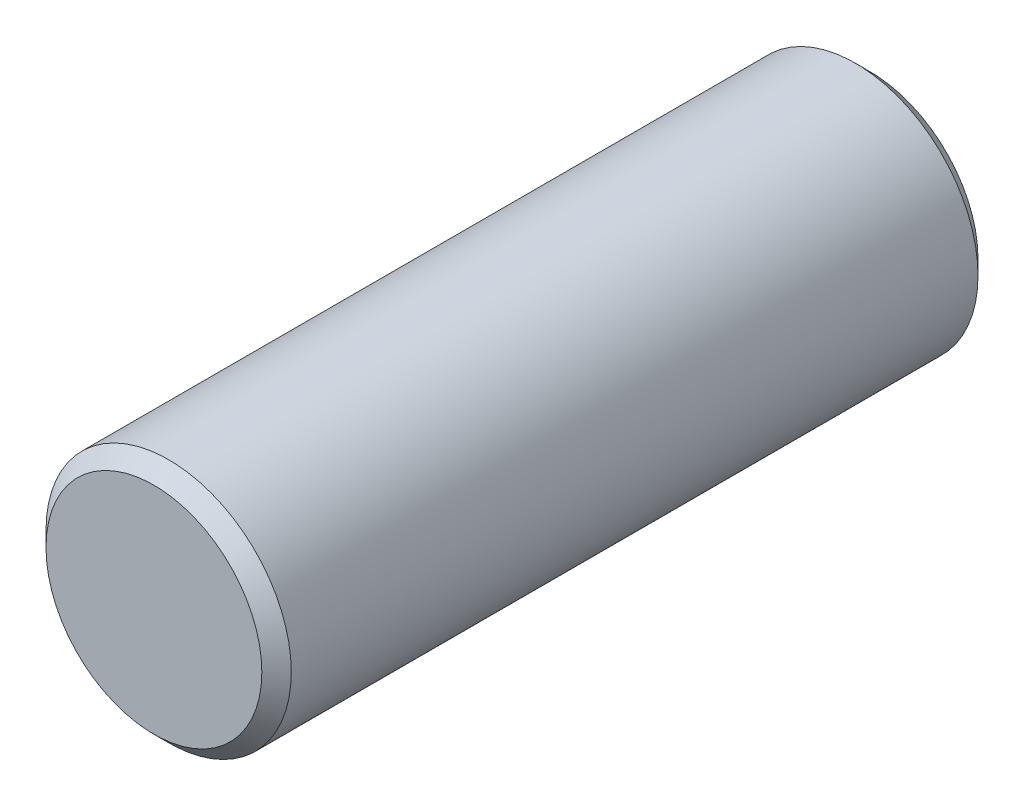
ISO-10303-21;
HEADER;
FILE_DESCRIPTION(('STEP AP214'),'2;1');
FILE_NAME('part.step','',(''),(''),'','','');
FILE_SCHEMA(('AUTOMOTIVE_DESIGN { 1 0 10303 214 1 1 1 1 }'));
ENDSEC;
DATA;
#1=APPLICATION_CONTEXT('core data for automotive mechanical design processes');
#2=APPLICATION_PROTOCOL_DEFINITION('international standard','automotive_design',2000,#1);
#3=PRODUCT_CONTEXT('',#1,'mechanical');
#4=PRODUCT('Part','Part','',(#3));
#5=PRODUCT_RELATED_PRODUCT_CATEGORY('part','',(#4));
#6=PRODUCT_DEFINITION_FORMATION('','',#4);
#7=PRODUCT_DEFINITION_CONTEXT('part definition',#1,'design');
#8=PRODUCT_DEFINITION('design','',#6,#7);
#9=PRODUCT_DEFINITION_SHAPE('','',#8);
#10=(LENGTH_UNIT() NAMED_UNIT(*) SI_UNIT(.MILLI.,.METRE.));
#11=(NAMED_UNIT(*) PLANE_ANGLE_UNIT() SI_UNIT($,.RADIAN.));
#12=(NAMED_UNIT(*) SI_UNIT($,.STERADIAN.) SOLID_ANGLE_UNIT());
#13=UNCERTAINTY_MEASURE_WITH_UNIT(LENGTH_MEASURE(1.E-05),#10,'distance_accuracy_value','');
#14=(GEOMETRIC_REPRESENTATION_CONTEXT(3) GLOBAL_UNCERTAINTY_ASSIGNED_CONTEXT((#13)) GLOBAL_UNIT_ASSIGNED_CONTEXT((#10,
#11,#12)) REPRESENTATION_CONTEXT('',''));
#15=CARTESIAN_POINT('',(0.,0.,0.));
#16=DIRECTION('',(0.,0.,1.));
#17=DIRECTION('',(1.,0.,0.));
#18=AXIS2_PLACEMENT_3D('',#15,#16,#17);
#19=CARTESIAN_POINT('',(-1.11022302462516E-13,0.,36.5));
#20=DIRECTION('',(0.,0.,-1.));
#21=DIRECTION('',(-1.,0.,0.));
#22=AXIS2_PLACEMENT_3D('',#19,#20,#21);
#23=CYLINDRICAL_SURFACE('',#22,12.5);
#24=CARTESIAN_POINT('',(-1.11022302462516E-13,0.,35.));
#25=DIRECTION('',(0.,0.,1.));
#26=DIRECTION('',(1.,0.,0.));
#27=AXIS2_PLACEMENT_3D('',#24,#25,#26);
#28=CIRCLE('',#27,12.5);
#29=CARTESIAN_POINT('',(12.4999999999999,0.,35.));
#30=VERTEX_POINT('',#29);
#31=EDGE_CURVE('E57',#30,#30,#28,.F.);
#32=ORIENTED_EDGE('',*,*,#31,.T.);
#33=EDGE_LOOP('',(#32));
#34=FACE_BOUND('',#33,.T.);
#35=CARTESIAN_POINT('',(-1.11022302462516E-13,0.,-35.));
#36=DIRECTION('',(0.,0.,1.));
#37=DIRECTION('',(1.,0.,0.));
#38=AXIS2_PLACEMENT_3D('',#35,#36,#37);
#39=CIRCLE('',#38,12.5);
#40=CARTESIAN_POINT('',(12.4999999999999,0.,-35.));
#41=VERTEX_POINT('',#40);
#42=EDGE_CURVE('E61',#41,#41,#39,.T.);
#43=ORIENTED_EDGE('',*,*,#42,.T.);
#44=EDGE_LOOP('',(#43));
#45=FACE_BOUND('',#44,.T.);
#46=ADVANCED_FACE('F50',(#34,#45),#23,.T.);
#47=CARTESIAN_POINT('',(-1.11022302462516E-13,0.,36.5));
#48=DIRECTION('',(0.,0.,1.));
#49=DIRECTION('',(1.,0.,0.));
#50=AXIS2_PLACEMENT_3D('',#47,#48,#49);
#51=PLANE('',#50);
#52=CARTESIAN_POINT('',(-1.11022302462516E-13,0.,36.5));
#53=DIRECTION('',(0.,0.,1.));
#54=DIRECTION('',(1.,0.,0.));
#55=AXIS2_PLACEMENT_3D('',#52,#53,#54);
#56=CIRCLE('',#55,11.);
#57=CARTESIAN_POINT('',(10.9999999999999,0.,36.5));
#58=VERTEX_POINT('',#57);
#59=EDGE_CURVE('E65',#58,#58,#56,.T.);
#60=ORIENTED_EDGE('',*,*,#59,.T.);
#61=EDGE_LOOP('',(#60));
#62=FACE_BOUND('',#61,.T.);
#63=ADVANCED_FACE('F71',(#62),#51,.T.);
#64=CARTESIAN_POINT('',(-1.11022302462516E-13,0.,-36.5));
#65=DIRECTION('',(0.,0.,1.));
#66=DIRECTION('',(1.,0.,0.));
#67=AXIS2_PLACEMENT_3D('',#64,#65,#66);
#68=PLANE('',#67);
#69=CARTESIAN_POINT('',(-1.11022302462516E-13,0.,-36.5));
#70=DIRECTION('',(0.,0.,1.));
#71=DIRECTION('',(1.,0.,0.));
#72=AXIS2_PLACEMENT_3D('',#69,#70,#71);
#73=CIRCLE('',#72,11.);
#74=CARTESIAN_POINT('',(10.9999999999999,0.,-36.5));
#75=VERTEX_POINT('',#74);
#76=EDGE_CURVE('E12',#75,#75,#73,.F.);
#77=ORIENTED_EDGE('',*,*,#76,.T.);
#78=EDGE_LOOP('',(#77));
#79=FACE_BOUND('',#78,.T.);
#80=ADVANCED_FACE('F75',(#79),#68,.F.);
#81=CARTESIAN_POINT('',(-1.11022302462516E-13,0.,36.5));
#82=DIRECTION('',(0.,0.,-1.));
#83=DIRECTION('',(-1.,0.,0.));
#84=AXIS2_PLACEMENT_3D('',#81,#82,#83);
#85=CONICAL_SURFACE('',#84,11.,0.785398163397446);
#86=ORIENTED_EDGE('',*,*,#31,.F.);
#87=EDGE_LOOP('',(#86));
#88=FACE_BOUND('',#87,.T.);
#89=ORIENTED_EDGE('',*,*,#59,.F.);
#90=EDGE_LOOP('',(#89));
#91=FACE_BOUND('',#90,.T.);
#92=ADVANCED_FACE('F73',(#88,#91),#85,.T.);
#93=CARTESIAN_POINT('',(-1.11022302462516E-13,0.,-35.));
#94=DIRECTION('',(0.,0.,1.));
#95=DIRECTION('',(1.,0.,0.));
#96=AXIS2_PLACEMENT_3D('',#93,#94,#95);
#97=CONICAL_SURFACE('',#96,12.5,0.785398163397447);
#98=ORIENTED_EDGE('',*,*,#76,.F.);
#99=EDGE_LOOP('',(#98));
#100=FACE_BOUND('',#99,.T.);
#101=ORIENTED_EDGE('',*,*,#42,.F.);
#102=EDGE_LOOP('',(#101));
#103=FACE_BOUND('',#102,.T.);
#104=ADVANCED_FACE('F52',(#100,#103),#97,.T.);
#105=CLOSED_SHELL('',(#46,#63,#80,#92,#104));
#106=MANIFOLD_SOLID_BREP('B2',#105);
#107=ADVANCED_BREP_SHAPE_REPRESENTATION('',(#18,#106),#14);
#108=SHAPE_DEFINITION_REPRESENTATION(#9,#107);
ENDSEC;
END-ISO-10303-21;
